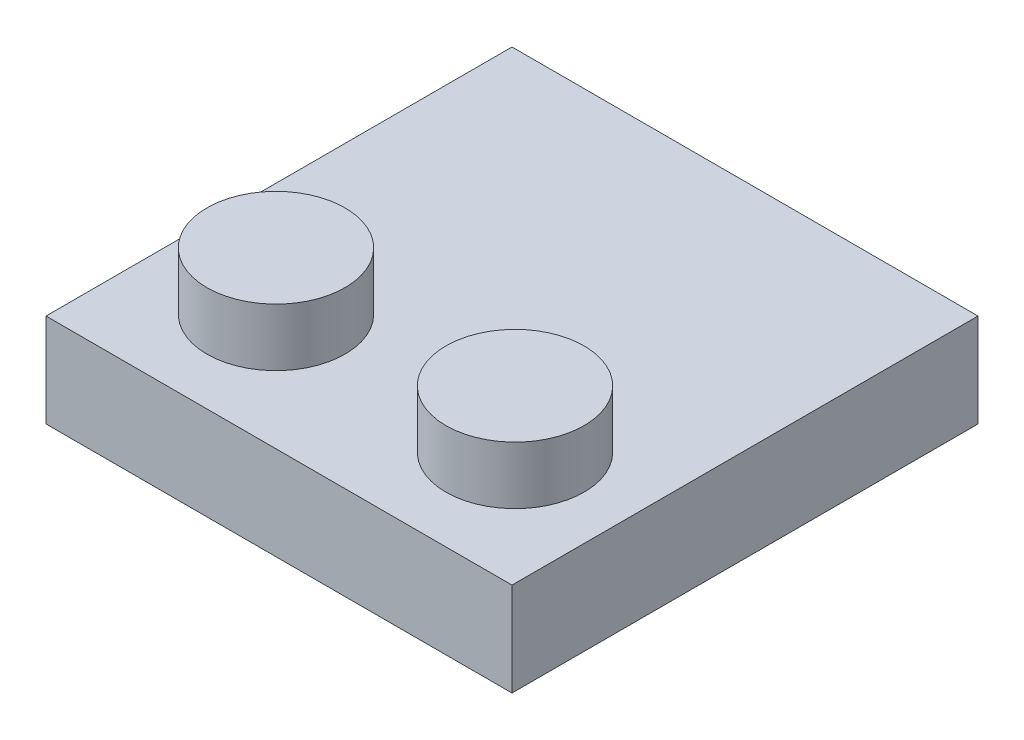
ISO-10303-21;
HEADER;
FILE_DESCRIPTION(('STEP AP214'),'2;1');
FILE_NAME('part.step','',(''),(''),'','','');
FILE_SCHEMA(('AUTOMOTIVE_DESIGN { 1 0 10303 214 1 1 1 1 }'));
ENDSEC;
DATA;
#1=APPLICATION_CONTEXT('core data for automotive mechanical design processes');
#2=APPLICATION_PROTOCOL_DEFINITION('international standard','automotive_design',2000,#1);
#3=PRODUCT_CONTEXT('',#1,'mechanical');
#4=PRODUCT('Part','Part','',(#3));
#5=PRODUCT_RELATED_PRODUCT_CATEGORY('part','',(#4));
#6=PRODUCT_DEFINITION_FORMATION('','',#4);
#7=PRODUCT_DEFINITION_CONTEXT('part definition',#1,'design');
#8=PRODUCT_DEFINITION('design','',#6,#7);
#9=PRODUCT_DEFINITION_SHAPE('','',#8);
#10=(LENGTH_UNIT() NAMED_UNIT(*) SI_UNIT(.MILLI.,.METRE.));
#11=(NAMED_UNIT(*) PLANE_ANGLE_UNIT() SI_UNIT($,.RADIAN.));
#12=(NAMED_UNIT(*) SI_UNIT($,.STERADIAN.) SOLID_ANGLE_UNIT());
#13=UNCERTAINTY_MEASURE_WITH_UNIT(LENGTH_MEASURE(1.E-05),#10,'distance_accuracy_value','');
#14=(GEOMETRIC_REPRESENTATION_CONTEXT(3) GLOBAL_UNCERTAINTY_ASSIGNED_CONTEXT((#13)) GLOBAL_UNIT_ASSIGNED_CONTEXT((#10,
#11,#12)) REPRESENTATION_CONTEXT('',''));
#15=CARTESIAN_POINT('',(0.,0.,0.));
#16=DIRECTION('',(0.,0.,1.));
#17=DIRECTION('',(1.,0.,0.));
#18=AXIS2_PLACEMENT_3D('',#15,#16,#17);
#19=CARTESIAN_POINT('',(7.92499999999999,-3.18,-7.925));
#20=DIRECTION('',(1.,0.,0.));
#21=DIRECTION('',(0.,0.,-1.));
#22=AXIS2_PLACEMENT_3D('',#19,#20,#21);
#23=PLANE('',#22);
#24=DIRECTION('',(0.,0.,-1.));
#25=VECTOR('',#24,1.);
#26=CARTESIAN_POINT('',(7.92499999999999,0.,-7.925));
#27=LINE('',#26,#25);
#28=CARTESIAN_POINT('',(7.92499999999999,0.,7.925));
#29=VERTEX_POINT('',#28);
#30=CARTESIAN_POINT('',(7.92499999999999,0.,-7.925));
#31=VERTEX_POINT('',#30);
#32=EDGE_CURVE('E168',#29,#31,#27,.T.);
#33=ORIENTED_EDGE('',*,*,#32,.F.);
#34=DIRECTION('',(0.,1.,0.));
#35=VECTOR('',#34,1.);
#36=CARTESIAN_POINT('',(7.92499999999999,-3.18,7.925));
#37=LINE('',#36,#35);
#38=CARTESIAN_POINT('',(7.92499999999999,-3.18,7.925));
#39=VERTEX_POINT('',#38);
#40=EDGE_CURVE('E40',#39,#29,#37,.T.);
#41=ORIENTED_EDGE('',*,*,#40,.F.);
#42=DIRECTION('',(0.,0.,-1.));
#43=VECTOR('',#42,1.);
#44=CARTESIAN_POINT('',(7.92499999999999,-3.18,-7.925));
#45=LINE('',#44,#43);
#46=CARTESIAN_POINT('',(7.92499999999999,-3.18,-7.925));
#47=VERTEX_POINT('',#46);
#48=EDGE_CURVE('E171',#39,#47,#45,.T.);
#49=ORIENTED_EDGE('',*,*,#48,.T.);
#50=DIRECTION('',(0.,1.,0.));
#51=VECTOR('',#50,1.);
#52=CARTESIAN_POINT('',(7.92499999999999,-3.18,-7.925));
#53=LINE('',#52,#51);
#54=EDGE_CURVE('E81',#47,#31,#53,.T.);
#55=ORIENTED_EDGE('',*,*,#54,.T.);
#56=EDGE_LOOP('',(#33,#41,#49,#55));
#57=FACE_BOUND('',#56,.T.);
#58=ADVANCED_FACE('F33',(#57),#23,.T.);
#59=CARTESIAN_POINT('',(-7.92500000000001,-3.18,7.925));
#60=DIRECTION('',(0.,0.,1.));
#61=DIRECTION('',(1.,0.,0.));
#62=AXIS2_PLACEMENT_3D('',#59,#60,#61);
#63=PLANE('',#62);
#64=DIRECTION('',(1.,0.,0.));
#65=VECTOR('',#64,1.);
#66=CARTESIAN_POINT('',(-7.92500000000001,0.,7.925));
#67=LINE('',#66,#65);
#68=CARTESIAN_POINT('',(-7.92500000000001,0.,7.925));
#69=VERTEX_POINT('',#68);
#70=EDGE_CURVE('E174',#69,#29,#67,.T.);
#71=ORIENTED_EDGE('',*,*,#70,.F.);
#72=DIRECTION('',(0.,1.,0.));
#73=VECTOR('',#72,1.);
#74=CARTESIAN_POINT('',(-7.92500000000001,-3.18,7.925));
#75=LINE('',#74,#73);
#76=CARTESIAN_POINT('',(-7.92500000000001,-3.18,7.925));
#77=VERTEX_POINT('',#76);
#78=EDGE_CURVE('E192',#77,#69,#75,.T.);
#79=ORIENTED_EDGE('',*,*,#78,.F.);
#80=DIRECTION('',(1.,0.,0.));
#81=VECTOR('',#80,1.);
#82=CARTESIAN_POINT('',(-7.92500000000001,-3.18,7.925));
#83=LINE('',#82,#81);
#84=EDGE_CURVE('E179',#77,#39,#83,.T.);
#85=ORIENTED_EDGE('',*,*,#84,.T.);
#86=ORIENTED_EDGE('',*,*,#40,.T.);
#87=EDGE_LOOP('',(#71,#79,#85,#86));
#88=FACE_BOUND('',#87,.T.);
#89=ADVANCED_FACE('F199',(#88),#63,.T.);
#90=CARTESIAN_POINT('',(-7.92500000000001,-3.18,-7.925));
#91=DIRECTION('',(-1.,0.,0.));
#92=DIRECTION('',(0.,0.,1.));
#93=AXIS2_PLACEMENT_3D('',#90,#91,#92);
#94=PLANE('',#93);
#95=DIRECTION('',(0.,0.,1.));
#96=VECTOR('',#95,1.);
#97=CARTESIAN_POINT('',(-7.92500000000001,0.,-7.925));
#98=LINE('',#97,#96);
#99=CARTESIAN_POINT('',(-7.92500000000001,0.,-7.925));
#100=VERTEX_POINT('',#99);
#101=EDGE_CURVE('E186',#100,#69,#98,.T.);
#102=ORIENTED_EDGE('',*,*,#101,.F.);
#103=DIRECTION('',(0.,1.,0.));
#104=VECTOR('',#103,1.);
#105=CARTESIAN_POINT('',(-7.92500000000001,-3.18,-7.925));
#106=LINE('',#105,#104);
#107=CARTESIAN_POINT('',(-7.92500000000001,-3.18,-7.925));
#108=VERTEX_POINT('',#107);
#109=EDGE_CURVE('E194',#108,#100,#106,.T.);
#110=ORIENTED_EDGE('',*,*,#109,.F.);
#111=DIRECTION('',(0.,0.,1.));
#112=VECTOR('',#111,1.);
#113=CARTESIAN_POINT('',(-7.92500000000001,-3.18,-7.925));
#114=LINE('',#113,#112);
#115=EDGE_CURVE('E176',#108,#77,#114,.T.);
#116=ORIENTED_EDGE('',*,*,#115,.T.);
#117=ORIENTED_EDGE('',*,*,#78,.T.);
#118=EDGE_LOOP('',(#102,#110,#116,#117));
#119=FACE_BOUND('',#118,.T.);
#120=ADVANCED_FACE('F203',(#119),#94,.T.);
#121=CARTESIAN_POINT('',(-7.92500000000001,-3.18,-7.925));
#122=DIRECTION('',(0.,0.,-1.));
#123=DIRECTION('',(-1.,0.,0.));
#124=AXIS2_PLACEMENT_3D('',#121,#122,#123);
#125=PLANE('',#124);
#126=DIRECTION('',(-1.,0.,0.));
#127=VECTOR('',#126,1.);
#128=CARTESIAN_POINT('',(-7.92500000000001,0.,-7.925));
#129=LINE('',#128,#127);
#130=EDGE_CURVE('E183',#31,#100,#129,.T.);
#131=ORIENTED_EDGE('',*,*,#130,.F.);
#132=ORIENTED_EDGE('',*,*,#54,.F.);
#133=DIRECTION('',(-1.,0.,0.));
#134=VECTOR('',#133,1.);
#135=CARTESIAN_POINT('',(-7.92500000000001,-3.18,-7.925));
#136=LINE('',#135,#134);
#137=EDGE_CURVE('E173',#47,#108,#136,.T.);
#138=ORIENTED_EDGE('',*,*,#137,.T.);
#139=ORIENTED_EDGE('',*,*,#109,.T.);
#140=EDGE_LOOP('',(#131,#132,#138,#139));
#141=FACE_BOUND('',#140,.T.);
#142=ADVANCED_FACE('F195',(#141),#125,.T.);
#143=CARTESIAN_POINT('',(0.,-3.18,0.));
#144=DIRECTION('',(0.,1.,0.));
#145=DIRECTION('',(0.,0.,1.));
#146=AXIS2_PLACEMENT_3D('',#143,#144,#145);
#147=PLANE('',#146);
#148=DIRECTION('',(1.,0.,0.));
#149=VECTOR('',#148,1.);
#150=CARTESIAN_POINT('',(0.,-3.18,6.545));
#151=LINE('',#150,#149);
#152=CARTESIAN_POINT('',(-6.54500000000002,-3.18,6.545));
#153=VERTEX_POINT('',#152);
#154=CARTESIAN_POINT('',(6.54499999999999,-3.18,6.545));
#155=VERTEX_POINT('',#154);
#156=EDGE_CURVE('E154',#153,#155,#151,.T.);
#157=ORIENTED_EDGE('',*,*,#156,.T.);
#158=DIRECTION('',(0.,0.,-1.));
#159=VECTOR('',#158,1.);
#160=CARTESIAN_POINT('',(6.54499999999999,-3.18,0.));
#161=LINE('',#160,#159);
#162=CARTESIAN_POINT('',(6.54499999999999,-3.18,-6.545));
#163=VERTEX_POINT('',#162);
#164=EDGE_CURVE('E110',#155,#163,#161,.T.);
#165=ORIENTED_EDGE('',*,*,#164,.T.);
#166=DIRECTION('',(-1.,0.,0.));
#167=VECTOR('',#166,1.);
#168=CARTESIAN_POINT('',(0.,-3.18,-6.545));
#169=LINE('',#168,#167);
#170=CARTESIAN_POINT('',(-6.54500000000002,-3.18,-6.545));
#171=VERTEX_POINT('',#170);
#172=EDGE_CURVE('E132',#163,#171,#169,.T.);
#173=ORIENTED_EDGE('',*,*,#172,.T.);
#174=DIRECTION('',(0.,0.,1.));
#175=VECTOR('',#174,1.);
#176=CARTESIAN_POINT('',(-6.54500000000002,-3.18,0.));
#177=LINE('',#176,#175);
#178=EDGE_CURVE('E47',#171,#153,#177,.T.);
#179=ORIENTED_EDGE('',*,*,#178,.T.);
#180=EDGE_LOOP('',(#157,#165,#173,#179));
#181=FACE_BOUND('',#180,.T.);
#182=ORIENTED_EDGE('',*,*,#48,.F.);
#183=ORIENTED_EDGE('',*,*,#84,.F.);
#184=ORIENTED_EDGE('',*,*,#115,.F.);
#185=ORIENTED_EDGE('',*,*,#137,.F.);
#186=EDGE_LOOP('',(#182,#183,#184,#185));
#187=FACE_BOUND('',#186,.T.);
#188=ADVANCED_FACE('F205',(#181,#187),#147,.F.);
#189=CARTESIAN_POINT('',(0.,0.,0.));
#190=DIRECTION('',(0.,1.,0.));
#191=DIRECTION('',(0.,0.,1.));
#192=AXIS2_PLACEMENT_3D('',#189,#190,#191);
#193=PLANE('',#192);
#194=CARTESIAN_POINT('',(4.06516658498324,0.,3.9625));
#195=DIRECTION('',(0.,1.,0.));
#196=DIRECTION('',(0.,0.,1.));
#197=AXIS2_PLACEMENT_3D('',#194,#195,#196);
#198=CIRCLE('',#197,2.35);
#199=CARTESIAN_POINT('',(4.06516658498324,0.,6.3125));
#200=VERTEX_POINT('',#199);
#201=EDGE_CURVE('E115',#200,#200,#198,.T.);
#202=ORIENTED_EDGE('',*,*,#201,.F.);
#203=EDGE_LOOP('',(#202));
#204=FACE_BOUND('',#203,.T.);
#205=CARTESIAN_POINT('',(-4.06500000000002,0.,3.9625));
#206=DIRECTION('',(0.,1.,0.));
#207=DIRECTION('',(0.,0.,1.));
#208=AXIS2_PLACEMENT_3D('',#205,#206,#207);
#209=CIRCLE('',#208,2.35);
#210=CARTESIAN_POINT('',(-4.06500000000002,0.,6.3125));
#211=VERTEX_POINT('',#210);
#212=EDGE_CURVE('E162',#211,#211,#209,.T.);
#213=ORIENTED_EDGE('',*,*,#212,.F.);
#214=EDGE_LOOP('',(#213));
#215=FACE_BOUND('',#214,.T.);
#216=ORIENTED_EDGE('',*,*,#32,.T.);
#217=ORIENTED_EDGE('',*,*,#130,.T.);
#218=ORIENTED_EDGE('',*,*,#101,.T.);
#219=ORIENTED_EDGE('',*,*,#70,.T.);
#220=EDGE_LOOP('',(#216,#217,#218,#219));
#221=FACE_BOUND('',#220,.T.);
#222=ADVANCED_FACE('F198',(#204,#215,#221),#193,.T.);
#223=CARTESIAN_POINT('',(-4.06500000000002,1.96,3.9625));
#224=DIRECTION('',(0.,-1.,0.));
#225=DIRECTION('',(0.,0.,-1.));
#226=AXIS2_PLACEMENT_3D('',#223,#224,#225);
#227=CYLINDRICAL_SURFACE('',#226,2.35);
#228=CARTESIAN_POINT('',(-4.06500000000002,1.96,3.9625));
#229=DIRECTION('',(0.,1.,0.));
#230=DIRECTION('',(0.,0.,1.));
#231=AXIS2_PLACEMENT_3D('',#228,#229,#230);
#232=CIRCLE('',#231,2.35);
#233=CARTESIAN_POINT('',(-4.06500000000002,1.96,6.3125));
#234=VERTEX_POINT('',#233);
#235=EDGE_CURVE('E165',#234,#234,#232,.T.);
#236=ORIENTED_EDGE('',*,*,#235,.F.);
#237=EDGE_LOOP('',(#236));
#238=FACE_BOUND('',#237,.T.);
#239=ORIENTED_EDGE('',*,*,#212,.T.);
#240=EDGE_LOOP('',(#239));
#241=FACE_BOUND('',#240,.T.);
#242=ADVANCED_FACE('F213',(#238,#241),#227,.T.);
#243=CARTESIAN_POINT('',(-4.06500000000002,1.96,3.9625));
#244=DIRECTION('',(0.,1.,0.));
#245=DIRECTION('',(0.,0.,1.));
#246=AXIS2_PLACEMENT_3D('',#243,#244,#245);
#247=PLANE('',#246);
#248=ORIENTED_EDGE('',*,*,#235,.T.);
#249=EDGE_LOOP('',(#248));
#250=FACE_BOUND('',#249,.T.);
#251=ADVANCED_FACE('F248',(#250),#247,.T.);
#252=CARTESIAN_POINT('',(4.06516658498324,1.96,3.9625));
#253=DIRECTION('',(0.,-1.,0.));
#254=DIRECTION('',(0.,0.,-1.));
#255=AXIS2_PLACEMENT_3D('',#252,#253,#254);
#256=CYLINDRICAL_SURFACE('',#255,2.35);
#257=CARTESIAN_POINT('',(4.06516658498324,1.96,3.9625));
#258=DIRECTION('',(0.,1.,0.));
#259=DIRECTION('',(0.,0.,1.));
#260=AXIS2_PLACEMENT_3D('',#257,#258,#259);
#261=CIRCLE('',#260,2.35);
#262=CARTESIAN_POINT('',(4.06516658498324,1.96,6.3125));
#263=VERTEX_POINT('',#262);
#264=EDGE_CURVE('E159',#263,#263,#261,.T.);
#265=ORIENTED_EDGE('',*,*,#264,.F.);
#266=EDGE_LOOP('',(#265));
#267=FACE_BOUND('',#266,.T.);
#268=ORIENTED_EDGE('',*,*,#201,.T.);
#269=EDGE_LOOP('',(#268));
#270=FACE_BOUND('',#269,.T.);
#271=ADVANCED_FACE('F257',(#267,#270),#256,.T.);
#272=CARTESIAN_POINT('',(4.06516658498324,1.96,3.9625));
#273=DIRECTION('',(0.,1.,0.));
#274=DIRECTION('',(0.,0.,1.));
#275=AXIS2_PLACEMENT_3D('',#272,#273,#274);
#276=PLANE('',#275);
#277=ORIENTED_EDGE('',*,*,#264,.T.);
#278=EDGE_LOOP('',(#277));
#279=FACE_BOUND('',#278,.T.);
#280=ADVANCED_FACE('F267',(#279),#276,.T.);
#281=CARTESIAN_POINT('',(6.54499999999999,-3.18,-7.925));
#282=DIRECTION('',(1.,0.,0.));
#283=DIRECTION('',(0.,0.,-1.));
#284=AXIS2_PLACEMENT_3D('',#281,#282,#283);
#285=PLANE('',#284);
#286=DIRECTION('',(0.,0.,-1.));
#287=VECTOR('',#286,1.);
#288=CARTESIAN_POINT('',(6.54499999999999,-1.38,0.));
#289=LINE('',#288,#287);
#290=CARTESIAN_POINT('',(6.54499999999999,-1.38,6.545));
#291=VERTEX_POINT('',#290);
#292=CARTESIAN_POINT('',(6.54499999999999,-1.38,-6.545));
#293=VERTEX_POINT('',#292);
#294=EDGE_CURVE('E108',#291,#293,#289,.T.);
#295=ORIENTED_EDGE('',*,*,#294,.T.);
#296=DIRECTION('',(0.,1.,0.));
#297=VECTOR('',#296,1.);
#298=CARTESIAN_POINT('',(6.54499999999999,-3.18,-6.545));
#299=LINE('',#298,#297);
#300=EDGE_CURVE('E137',#163,#293,#299,.T.);
#301=ORIENTED_EDGE('',*,*,#300,.F.);
#302=ORIENTED_EDGE('',*,*,#164,.F.);
#303=DIRECTION('',(0.,1.,0.));
#304=VECTOR('',#303,1.);
#305=CARTESIAN_POINT('',(6.54499999999999,-3.18,6.545));
#306=LINE('',#305,#304);
#307=EDGE_CURVE('E105',#155,#291,#306,.T.);
#308=ORIENTED_EDGE('',*,*,#307,.T.);
#309=EDGE_LOOP('',(#295,#301,#302,#308));
#310=FACE_BOUND('',#309,.T.);
#311=ADVANCED_FACE('F107',(#310),#285,.F.);
#312=CARTESIAN_POINT('',(-7.92500000000001,-3.18,6.545));
#313=DIRECTION('',(0.,0.,1.));
#314=DIRECTION('',(1.,0.,0.));
#315=AXIS2_PLACEMENT_3D('',#312,#313,#314);
#316=PLANE('',#315);
#317=DIRECTION('',(1.,0.,0.));
#318=VECTOR('',#317,1.);
#319=CARTESIAN_POINT('',(0.,-1.38,6.545));
#320=LINE('',#319,#318);
#321=CARTESIAN_POINT('',(-6.54500000000002,-1.38,6.545));
#322=VERTEX_POINT('',#321);
#323=EDGE_CURVE('E123',#322,#291,#320,.T.);
#324=ORIENTED_EDGE('',*,*,#323,.T.);
#325=ORIENTED_EDGE('',*,*,#307,.F.);
#326=ORIENTED_EDGE('',*,*,#156,.F.);
#327=DIRECTION('',(0.,1.,0.));
#328=VECTOR('',#327,1.);
#329=CARTESIAN_POINT('',(-6.54500000000002,-3.18,6.545));
#330=LINE('',#329,#328);
#331=EDGE_CURVE('E116',#153,#322,#330,.T.);
#332=ORIENTED_EDGE('',*,*,#331,.T.);
#333=EDGE_LOOP('',(#324,#325,#326,#332));
#334=FACE_BOUND('',#333,.T.);
#335=ADVANCED_FACE('F128',(#334),#316,.F.);
#336=CARTESIAN_POINT('',(-6.54500000000002,-3.18,-7.925));
#337=DIRECTION('',(-1.,0.,0.));
#338=DIRECTION('',(0.,0.,1.));
#339=AXIS2_PLACEMENT_3D('',#336,#337,#338);
#340=PLANE('',#339);
#341=DIRECTION('',(0.,0.,1.));
#342=VECTOR('',#341,1.);
#343=CARTESIAN_POINT('',(-6.54500000000002,-1.38,0.));
#344=LINE('',#343,#342);
#345=CARTESIAN_POINT('',(-6.54500000000002,-1.38,-6.545));
#346=VERTEX_POINT('',#345);
#347=EDGE_CURVE('E130',#346,#322,#344,.T.);
#348=ORIENTED_EDGE('',*,*,#347,.T.);
#349=ORIENTED_EDGE('',*,*,#331,.F.);
#350=ORIENTED_EDGE('',*,*,#178,.F.);
#351=DIRECTION('',(0.,1.,0.));
#352=VECTOR('',#351,1.);
#353=CARTESIAN_POINT('',(-6.54500000000002,-3.18,-6.545));
#354=LINE('',#353,#352);
#355=EDGE_CURVE('E138',#171,#346,#354,.T.);
#356=ORIENTED_EDGE('',*,*,#355,.T.);
#357=EDGE_LOOP('',(#348,#349,#350,#356));
#358=FACE_BOUND('',#357,.T.);
#359=ADVANCED_FACE('F297',(#358),#340,.F.);
#360=CARTESIAN_POINT('',(-7.92500000000001,-3.18,-6.545));
#361=DIRECTION('',(0.,0.,-1.));
#362=DIRECTION('',(-1.,0.,0.));
#363=AXIS2_PLACEMENT_3D('',#360,#361,#362);
#364=PLANE('',#363);
#365=DIRECTION('',(-1.,0.,0.));
#366=VECTOR('',#365,1.);
#367=CARTESIAN_POINT('',(0.,-1.38,-6.545));
#368=LINE('',#367,#366);
#369=EDGE_CURVE('E125',#293,#346,#368,.T.);
#370=ORIENTED_EDGE('',*,*,#369,.T.);
#371=ORIENTED_EDGE('',*,*,#355,.F.);
#372=ORIENTED_EDGE('',*,*,#172,.F.);
#373=ORIENTED_EDGE('',*,*,#300,.T.);
#374=EDGE_LOOP('',(#370,#371,#372,#373));
#375=FACE_BOUND('',#374,.T.);
#376=ADVANCED_FACE('F306',(#375),#364,.F.);
#377=CARTESIAN_POINT('',(0.,-1.38,0.));
#378=DIRECTION('',(0.,1.,0.));
#379=DIRECTION('',(0.,0.,1.));
#380=AXIS2_PLACEMENT_3D('',#377,#378,#379);
#381=PLANE('',#380);
#382=CARTESIAN_POINT('',(0.,-1.38,0.));
#383=DIRECTION('',(0.,1.,0.));
#384=DIRECTION('',(0.,0.,1.));
#385=AXIS2_PLACEMENT_3D('',#382,#383,#384);
#386=CIRCLE('',#385,3.1);
#387=CARTESIAN_POINT('',(0.,-1.38,3.1));
#388=VERTEX_POINT('',#387);
#389=EDGE_CURVE('E11',#388,#388,#386,.F.);
#390=ORIENTED_EDGE('',*,*,#389,.F.);
#391=EDGE_LOOP('',(#390));
#392=FACE_BOUND('',#391,.T.);
#393=CARTESIAN_POINT('',(4.06516658498324,-1.38,3.9625));
#394=DIRECTION('',(0.,1.,0.));
#395=DIRECTION('',(0.,0.,1.));
#396=AXIS2_PLACEMENT_3D('',#393,#394,#395);
#397=CIRCLE('',#396,0.97);
#398=CARTESIAN_POINT('',(4.06516658498324,-1.38,4.9325));
#399=VERTEX_POINT('',#398);
#400=EDGE_CURVE('E142',#399,#399,#397,.T.);
#401=ORIENTED_EDGE('',*,*,#400,.T.);
#402=EDGE_LOOP('',(#401));
#403=FACE_BOUND('',#402,.T.);
#404=CARTESIAN_POINT('',(-4.06500000000002,-1.38,3.9625));
#405=DIRECTION('',(0.,1.,0.));
#406=DIRECTION('',(0.,0.,1.));
#407=AXIS2_PLACEMENT_3D('',#404,#405,#406);
#408=CIRCLE('',#407,0.970000000000001);
#409=CARTESIAN_POINT('',(-4.06500000000002,-1.38,4.9325));
#410=VERTEX_POINT('',#409);
#411=EDGE_CURVE('E147',#410,#410,#408,.T.);
#412=ORIENTED_EDGE('',*,*,#411,.T.);
#413=EDGE_LOOP('',(#412));
#414=FACE_BOUND('',#413,.T.);
#415=ORIENTED_EDGE('',*,*,#294,.F.);
#416=ORIENTED_EDGE('',*,*,#323,.F.);
#417=ORIENTED_EDGE('',*,*,#347,.F.);
#418=ORIENTED_EDGE('',*,*,#369,.F.);
#419=EDGE_LOOP('',(#415,#416,#417,#418));
#420=FACE_BOUND('',#419,.T.);
#421=ADVANCED_FACE('F121',(#392,#403,#414,#420),#381,.F.);
#422=CARTESIAN_POINT('',(-4.06500000000002,1.96,3.9625));
#423=DIRECTION('',(0.,-1.,0.));
#424=DIRECTION('',(0.,0.,-1.));
#425=AXIS2_PLACEMENT_3D('',#422,#423,#424);
#426=CYLINDRICAL_SURFACE('',#425,0.970000000000001);
#427=CARTESIAN_POINT('',(-4.06500000000002,0.58,3.9625));
#428=DIRECTION('',(0.,1.,0.));
#429=DIRECTION('',(0.,0.,1.));
#430=AXIS2_PLACEMENT_3D('',#427,#428,#429);
#431=CIRCLE('',#430,0.970000000000001);
#432=CARTESIAN_POINT('',(-4.06500000000002,0.58,4.9325));
#433=VERTEX_POINT('',#432);
#434=EDGE_CURVE('E126',#433,#433,#431,.T.);
#435=ORIENTED_EDGE('',*,*,#434,.T.);
#436=EDGE_LOOP('',(#435));
#437=FACE_BOUND('',#436,.T.);
#438=ORIENTED_EDGE('',*,*,#411,.F.);
#439=EDGE_LOOP('',(#438));
#440=FACE_BOUND('',#439,.T.);
#441=ADVANCED_FACE('F322',(#437,#440),#426,.F.);
#442=CARTESIAN_POINT('',(-4.06500000000002,0.58,3.9625));
#443=DIRECTION('',(0.,1.,0.));
#444=DIRECTION('',(0.,0.,1.));
#445=AXIS2_PLACEMENT_3D('',#442,#443,#444);
#446=PLANE('',#445);
#447=ORIENTED_EDGE('',*,*,#434,.F.);
#448=EDGE_LOOP('',(#447));
#449=FACE_BOUND('',#448,.T.);
#450=ADVANCED_FACE('F327',(#449),#446,.F.);
#451=CARTESIAN_POINT('',(4.06516658498324,1.96,3.9625));
#452=DIRECTION('',(0.,-1.,0.));
#453=DIRECTION('',(0.,0.,-1.));
#454=AXIS2_PLACEMENT_3D('',#451,#452,#453);
#455=CYLINDRICAL_SURFACE('',#454,0.97);
#456=CARTESIAN_POINT('',(4.06516658498324,0.58,3.9625));
#457=DIRECTION('',(0.,1.,0.));
#458=DIRECTION('',(0.,0.,1.));
#459=AXIS2_PLACEMENT_3D('',#456,#457,#458);
#460=CIRCLE('',#459,0.97);
#461=CARTESIAN_POINT('',(4.06516658498324,0.58,4.9325));
#462=VERTEX_POINT('',#461);
#463=EDGE_CURVE('E145',#462,#462,#460,.T.);
#464=ORIENTED_EDGE('',*,*,#463,.T.);
#465=EDGE_LOOP('',(#464));
#466=FACE_BOUND('',#465,.T.);
#467=ORIENTED_EDGE('',*,*,#400,.F.);
#468=EDGE_LOOP('',(#467));
#469=FACE_BOUND('',#468,.T.);
#470=ADVANCED_FACE('F337',(#466,#469),#455,.F.);
#471=CARTESIAN_POINT('',(4.06516658498324,0.58,3.9625));
#472=DIRECTION('',(0.,1.,0.));
#473=DIRECTION('',(0.,0.,1.));
#474=AXIS2_PLACEMENT_3D('',#471,#472,#473);
#475=PLANE('',#474);
#476=ORIENTED_EDGE('',*,*,#463,.F.);
#477=EDGE_LOOP('',(#476));
#478=FACE_BOUND('',#477,.T.);
#479=ADVANCED_FACE('F347',(#478),#475,.F.);
#480=CARTESIAN_POINT('',(0.,-2.86,0.));
#481=DIRECTION('',(0.,-1.,0.));
#482=DIRECTION('',(0.,0.,-1.));
#483=AXIS2_PLACEMENT_3D('',#480,#481,#482);
#484=PLANE('',#483);
#485=CARTESIAN_POINT('',(0.,-2.86,0.));
#486=DIRECTION('',(0.,-1.,0.));
#487=DIRECTION('',(0.,0.,-1.));
#488=AXIS2_PLACEMENT_3D('',#485,#486,#487);
#489=CIRCLE('',#488,3.1);
#490=CARTESIAN_POINT('',(0.,-2.86,-3.1));
#491=VERTEX_POINT('',#490);
#492=EDGE_CURVE('E146',#491,#491,#489,.T.);
#493=ORIENTED_EDGE('',*,*,#492,.T.);
#494=EDGE_LOOP('',(#493));
#495=FACE_BOUND('',#494,.T.);
#496=CARTESIAN_POINT('',(0.,-2.86,0.));
#497=DIRECTION('',(0.,-1.,0.));
#498=DIRECTION('',(0.,0.,-1.));
#499=AXIS2_PLACEMENT_3D('',#496,#497,#498);
#500=CIRCLE('',#499,2.82);
#501=CARTESIAN_POINT('',(0.,-2.86,-2.82));
#502=VERTEX_POINT('',#501);
#503=EDGE_CURVE('E411',#502,#502,#500,.T.);
#504=ORIENTED_EDGE('',*,*,#503,.F.);
#505=EDGE_LOOP('',(#504));
#506=FACE_BOUND('',#505,.T.);
#507=ADVANCED_FACE('F357',(#495,#506),#484,.T.);
#508=CARTESIAN_POINT('',(0.,-2.86,0.));
#509=DIRECTION('',(0.,1.,0.));
#510=DIRECTION('',(0.,0.,1.));
#511=AXIS2_PLACEMENT_3D('',#508,#509,#510);
#512=CYLINDRICAL_SURFACE('',#511,3.1);
#513=ORIENTED_EDGE('',*,*,#492,.F.);
#514=EDGE_LOOP('',(#513));
#515=FACE_BOUND('',#514,.T.);
#516=ORIENTED_EDGE('',*,*,#389,.T.);
#517=EDGE_LOOP('',(#516));
#518=FACE_BOUND('',#517,.T.);
#519=ADVANCED_FACE('F376',(#515,#518),#512,.T.);
#520=CARTESIAN_POINT('',(0.,-2.86,0.));
#521=DIRECTION('',(0.,1.,0.));
#522=DIRECTION('',(0.,0.,1.));
#523=AXIS2_PLACEMENT_3D('',#520,#521,#522);
#524=CYLINDRICAL_SURFACE('',#523,2.82);
#525=ORIENTED_EDGE('',*,*,#503,.T.);
#526=EDGE_LOOP('',(#525));
#527=FACE_BOUND('',#526,.T.);
#528=CARTESIAN_POINT('',(0.,-1.38,0.));
#529=DIRECTION('',(0.,-1.,0.));
#530=DIRECTION('',(0.,0.,-1.));
#531=AXIS2_PLACEMENT_3D('',#528,#529,#530);
#532=CIRCLE('',#531,2.82);
#533=CARTESIAN_POINT('',(0.,-1.38,-2.82));
#534=VERTEX_POINT('',#533);
#535=EDGE_CURVE('E409',#534,#534,#532,.T.);
#536=ORIENTED_EDGE('',*,*,#535,.F.);
#537=EDGE_LOOP('',(#536));
#538=FACE_BOUND('',#537,.T.);
#539=ADVANCED_FACE('F386',(#527,#538),#524,.F.);
#540=ORIENTED_EDGE('',*,*,#535,.T.);
#541=EDGE_LOOP('',(#540));
#542=FACE_BOUND('',#541,.T.);
#543=ADVANCED_FACE('F369',(#542),#381,.F.);
#544=CLOSED_SHELL('',(#58,#89,#120,#142,#188,#222,#242,#251,#271,#280,#311,#335,#359,#376,#421,
#441,#450,#470,#479,#507,#519,#539,#543));
#545=MANIFOLD_SOLID_BREP('B2',#544);
#546=ADVANCED_BREP_SHAPE_REPRESENTATION('',(#18,#545),#14);
#547=SHAPE_DEFINITION_REPRESENTATION(#9,#546);
ENDSEC;
END-ISO-10303-21;
